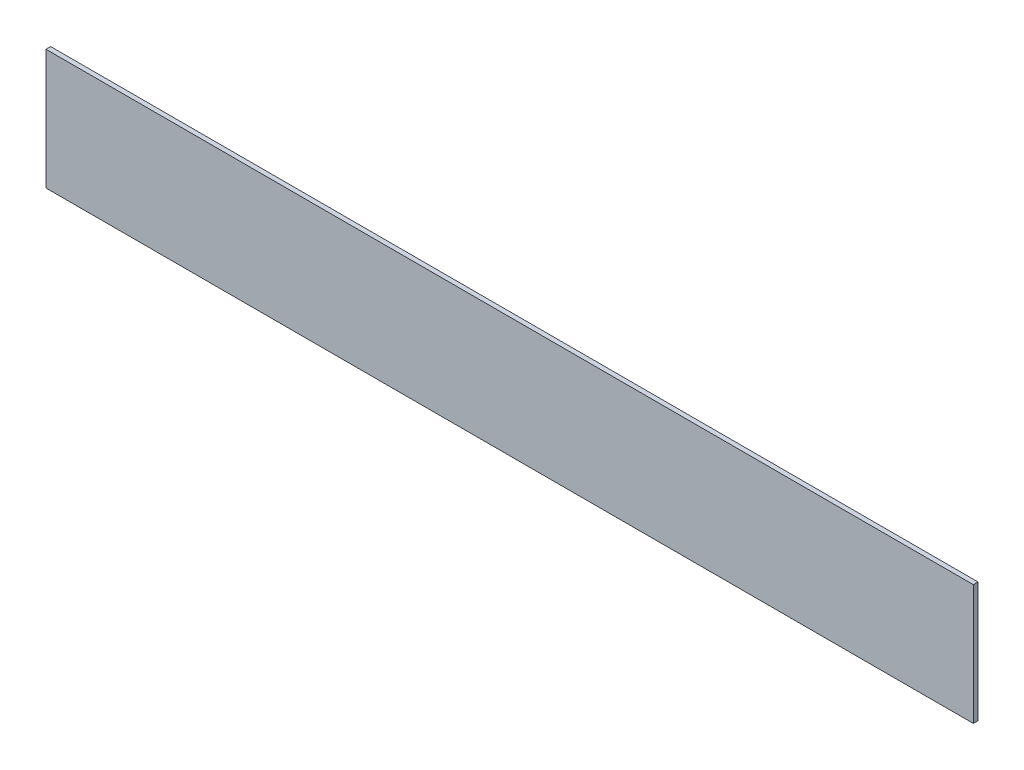
ISO-10303-21;
HEADER;
FILE_DESCRIPTION(('STEP AP214'),'2;1');
FILE_NAME('part.step','',(''),(''),'','','');
FILE_SCHEMA(('AUTOMOTIVE_DESIGN { 1 0 10303 214 1 1 1 1 }'));
ENDSEC;
DATA;
#1=APPLICATION_CONTEXT('core data for automotive mechanical design processes');
#2=APPLICATION_PROTOCOL_DEFINITION('international standard','automotive_design',2000,#1);
#3=PRODUCT_CONTEXT('',#1,'mechanical');
#4=PRODUCT('Part','Part','',(#3));
#5=PRODUCT_RELATED_PRODUCT_CATEGORY('part','',(#4));
#6=PRODUCT_DEFINITION_FORMATION('','',#4);
#7=PRODUCT_DEFINITION_CONTEXT('part definition',#1,'design');
#8=PRODUCT_DEFINITION('design','',#6,#7);
#9=PRODUCT_DEFINITION_SHAPE('','',#8);
#10=(LENGTH_UNIT() NAMED_UNIT(*) SI_UNIT(.MILLI.,.METRE.));
#11=(NAMED_UNIT(*) PLANE_ANGLE_UNIT() SI_UNIT($,.RADIAN.));
#12=(NAMED_UNIT(*) SI_UNIT($,.STERADIAN.) SOLID_ANGLE_UNIT());
#13=UNCERTAINTY_MEASURE_WITH_UNIT(LENGTH_MEASURE(1.E-05),#10,'distance_accuracy_value','');
#14=(GEOMETRIC_REPRESENTATION_CONTEXT(3) GLOBAL_UNCERTAINTY_ASSIGNED_CONTEXT((#13)) GLOBAL_UNIT_ASSIGNED_CONTEXT((#10,
#11,#12)) REPRESENTATION_CONTEXT('',''));
#15=CARTESIAN_POINT('',(0.,0.,0.));
#16=DIRECTION('',(0.,0.,1.));
#17=DIRECTION('',(1.,0.,0.));
#18=AXIS2_PLACEMENT_3D('',#15,#16,#17);
#19=CARTESIAN_POINT('',(-248.084515788493,-204.07476635514,3.));
#20=DIRECTION('',(1.,0.,0.));
#21=DIRECTION('',(0.,1.,0.));
#22=AXIS2_PLACEMENT_3D('',#19,#20,#21);
#23=PLANE('',#22);
#24=DIRECTION('',(0.,-1.,0.));
#25=VECTOR('',#24,1.);
#26=CARTESIAN_POINT('',(-248.084515788493,-204.07476635514,0.));
#27=LINE('',#26,#25);
#28=CARTESIAN_POINT('',(-248.084515788493,-204.07476635514,0.));
#29=VERTEX_POINT('',#28);
#30=CARTESIAN_POINT('',(-248.084515788493,-281.07476635514,0.));
#31=VERTEX_POINT('',#30);
#32=EDGE_CURVE('E107',#29,#31,#27,.T.);
#33=ORIENTED_EDGE('',*,*,#32,.T.);
#34=DIRECTION('',(0.,0.,-1.));
#35=VECTOR('',#34,1.);
#36=CARTESIAN_POINT('',(-248.084515788493,-281.07476635514,3.));
#37=LINE('',#36,#35);
#38=CARTESIAN_POINT('',(-248.084515788493,-281.07476635514,3.));
#39=VERTEX_POINT('',#38);
#40=EDGE_CURVE('E11',#39,#31,#37,.T.);
#41=ORIENTED_EDGE('',*,*,#40,.F.);
#42=DIRECTION('',(0.,-1.,0.));
#43=VECTOR('',#42,1.);
#44=CARTESIAN_POINT('',(-248.084515788493,-204.07476635514,3.));
#45=LINE('',#44,#43);
#46=CARTESIAN_POINT('',(-248.084515788493,-204.07476635514,3.));
#47=VERTEX_POINT('',#46);
#48=EDGE_CURVE('E91',#47,#39,#45,.T.);
#49=ORIENTED_EDGE('',*,*,#48,.F.);
#50=DIRECTION('',(0.,0.,-1.));
#51=VECTOR('',#50,1.);
#52=CARTESIAN_POINT('',(-248.084515788493,-204.07476635514,3.));
#53=LINE('',#52,#51);
#54=EDGE_CURVE('E103',#47,#29,#53,.T.);
#55=ORIENTED_EDGE('',*,*,#54,.T.);
#56=EDGE_LOOP('',(#33,#41,#49,#55));
#57=FACE_BOUND('',#56,.T.);
#58=ADVANCED_FACE('F39',(#57),#23,.F.);
#59=CARTESIAN_POINT('',(-248.084515788493,-281.07476635514,3.));
#60=DIRECTION('',(0.,1.,0.));
#61=DIRECTION('',(0.,0.,1.));
#62=AXIS2_PLACEMENT_3D('',#59,#60,#61);
#63=PLANE('',#62);
#64=DIRECTION('',(1.,0.,0.));
#65=VECTOR('',#64,1.);
#66=CARTESIAN_POINT('',(-248.084515788493,-281.07476635514,0.));
#67=LINE('',#66,#65);
#68=CARTESIAN_POINT('',(345.915484211507,-281.07476635514,0.));
#69=VERTEX_POINT('',#68);
#70=EDGE_CURVE('E96',#31,#69,#67,.T.);
#71=ORIENTED_EDGE('',*,*,#70,.T.);
#72=DIRECTION('',(0.,0.,-1.));
#73=VECTOR('',#72,1.);
#74=CARTESIAN_POINT('',(345.915484211507,-281.07476635514,3.));
#75=LINE('',#74,#73);
#76=CARTESIAN_POINT('',(345.915484211507,-281.07476635514,3.));
#77=VERTEX_POINT('',#76);
#78=EDGE_CURVE('E48',#77,#69,#75,.T.);
#79=ORIENTED_EDGE('',*,*,#78,.F.);
#80=DIRECTION('',(1.,0.,0.));
#81=VECTOR('',#80,1.);
#82=CARTESIAN_POINT('',(-248.084515788493,-281.07476635514,3.));
#83=LINE('',#82,#81);
#84=EDGE_CURVE('E86',#39,#77,#83,.T.);
#85=ORIENTED_EDGE('',*,*,#84,.F.);
#86=ORIENTED_EDGE('',*,*,#40,.T.);
#87=EDGE_LOOP('',(#71,#79,#85,#86));
#88=FACE_BOUND('',#87,.T.);
#89=ADVANCED_FACE('F95',(#88),#63,.F.);
#90=CARTESIAN_POINT('',(345.915484211507,-204.07476635514,3.));
#91=DIRECTION('',(-1.,0.,0.));
#92=DIRECTION('',(0.,-1.,0.));
#93=AXIS2_PLACEMENT_3D('',#90,#91,#92);
#94=PLANE('',#93);
#95=DIRECTION('',(0.,1.,0.));
#96=VECTOR('',#95,1.);
#97=CARTESIAN_POINT('',(345.915484211507,-204.07476635514,0.));
#98=LINE('',#97,#96);
#99=CARTESIAN_POINT('',(345.915484211507,-204.07476635514,0.));
#100=VERTEX_POINT('',#99);
#101=EDGE_CURVE('E73',#69,#100,#98,.T.);
#102=ORIENTED_EDGE('',*,*,#101,.T.);
#103=DIRECTION('',(0.,0.,-1.));
#104=VECTOR('',#103,1.);
#105=CARTESIAN_POINT('',(345.915484211507,-204.07476635514,3.));
#106=LINE('',#105,#104);
#107=CARTESIAN_POINT('',(345.915484211507,-204.07476635514,3.));
#108=VERTEX_POINT('',#107);
#109=EDGE_CURVE('E98',#108,#100,#106,.T.);
#110=ORIENTED_EDGE('',*,*,#109,.F.);
#111=DIRECTION('',(0.,1.,0.));
#112=VECTOR('',#111,1.);
#113=CARTESIAN_POINT('',(345.915484211507,-204.07476635514,3.));
#114=LINE('',#113,#112);
#115=EDGE_CURVE('E89',#77,#108,#114,.T.);
#116=ORIENTED_EDGE('',*,*,#115,.F.);
#117=ORIENTED_EDGE('',*,*,#78,.T.);
#118=EDGE_LOOP('',(#102,#110,#116,#117));
#119=FACE_BOUND('',#118,.T.);
#120=ADVANCED_FACE('F99',(#119),#94,.F.);
#121=CARTESIAN_POINT('',(-248.084515788493,-204.07476635514,3.));
#122=DIRECTION('',(0.,-1.,0.));
#123=DIRECTION('',(1.,0.,0.));
#124=AXIS2_PLACEMENT_3D('',#121,#122,#123);
#125=PLANE('',#124);
#126=DIRECTION('',(-1.,0.,0.));
#127=VECTOR('',#126,1.);
#128=CARTESIAN_POINT('',(-248.084515788493,-204.07476635514,0.));
#129=LINE('',#128,#127);
#130=EDGE_CURVE('E79',#100,#29,#129,.T.);
#131=ORIENTED_EDGE('',*,*,#130,.T.);
#132=ORIENTED_EDGE('',*,*,#54,.F.);
#133=DIRECTION('',(-1.,0.,0.));
#134=VECTOR('',#133,1.);
#135=CARTESIAN_POINT('',(-248.084515788493,-204.07476635514,3.));
#136=LINE('',#135,#134);
#137=EDGE_CURVE('E56',#108,#47,#136,.T.);
#138=ORIENTED_EDGE('',*,*,#137,.F.);
#139=ORIENTED_EDGE('',*,*,#109,.T.);
#140=EDGE_LOOP('',(#131,#132,#138,#139));
#141=FACE_BOUND('',#140,.T.);
#142=ADVANCED_FACE('F120',(#141),#125,.F.);
#143=CARTESIAN_POINT('',(0.,0.,3.));
#144=DIRECTION('',(0.,0.,1.));
#145=DIRECTION('',(1.,0.,0.));
#146=AXIS2_PLACEMENT_3D('',#143,#144,#145);
#147=PLANE('',#146);
#148=ORIENTED_EDGE('',*,*,#48,.T.);
#149=ORIENTED_EDGE('',*,*,#84,.T.);
#150=ORIENTED_EDGE('',*,*,#115,.T.);
#151=ORIENTED_EDGE('',*,*,#137,.T.);
#152=EDGE_LOOP('',(#148,#149,#150,#151));
#153=FACE_BOUND('',#152,.T.);
#154=ADVANCED_FACE('F87',(#153),#147,.T.);
#155=CARTESIAN_POINT('',(0.,0.,0.));
#156=DIRECTION('',(0.,0.,1.));
#157=DIRECTION('',(1.,0.,0.));
#158=AXIS2_PLACEMENT_3D('',#155,#156,#157);
#159=PLANE('',#158);
#160=ORIENTED_EDGE('',*,*,#32,.F.);
#161=ORIENTED_EDGE('',*,*,#130,.F.);
#162=ORIENTED_EDGE('',*,*,#101,.F.);
#163=ORIENTED_EDGE('',*,*,#70,.F.);
#164=EDGE_LOOP('',(#160,#161,#162,#163));
#165=FACE_BOUND('',#164,.T.);
#166=ADVANCED_FACE('F123',(#165),#159,.F.);
#167=CLOSED_SHELL('',(#58,#89,#120,#142,#154,#166));
#168=MANIFOLD_SOLID_BREP('B2',#167);
#169=ADVANCED_BREP_SHAPE_REPRESENTATION('',(#18,#168),#14);
#170=SHAPE_DEFINITION_REPRESENTATION(#9,#169);
ENDSEC;
END-ISO-10303-21;
